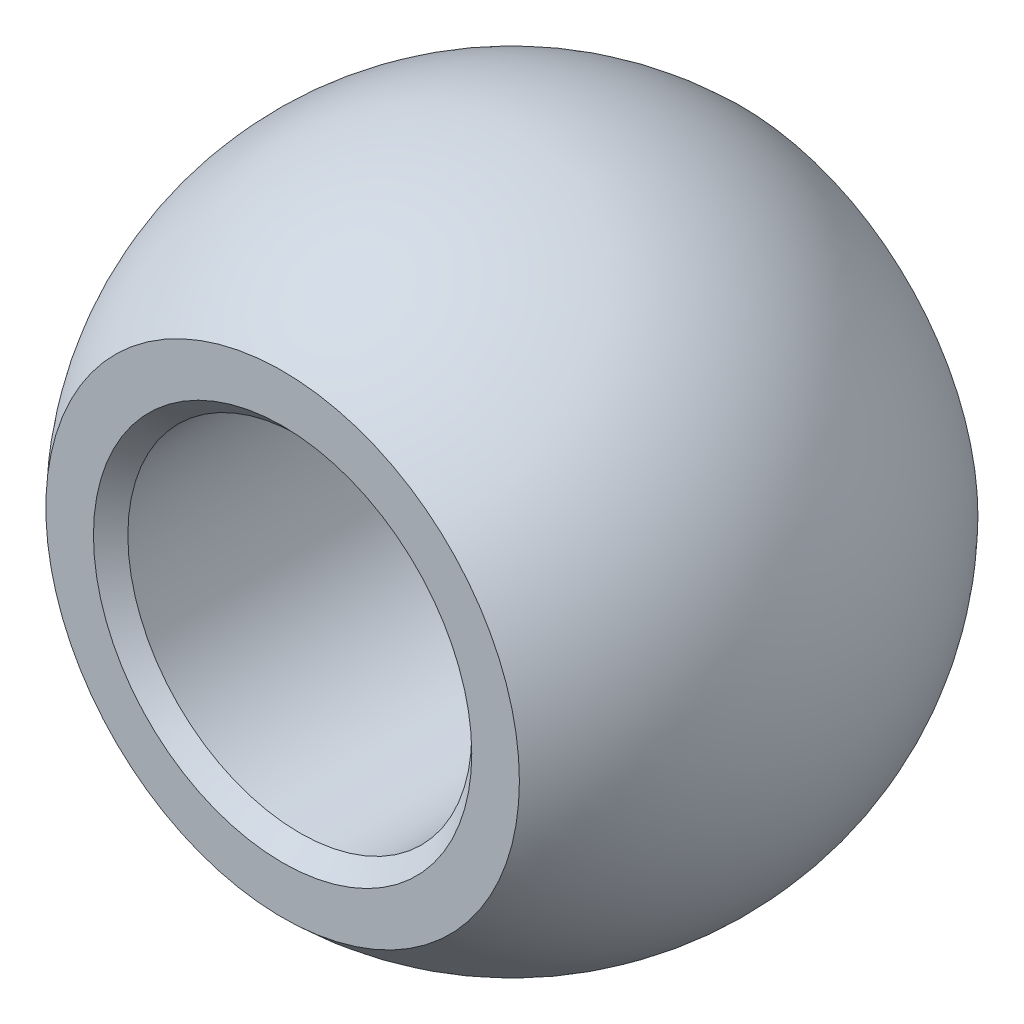
ISO-10303-21;
HEADER;
FILE_DESCRIPTION(('STEP AP214'),'2;1');
FILE_NAME('part.step','',(''),(''),'','','');
FILE_SCHEMA(('AUTOMOTIVE_DESIGN { 1 0 10303 214 1 1 1 1 }'));
ENDSEC;
DATA;
#1=APPLICATION_CONTEXT('core data for automotive mechanical design processes');
#2=APPLICATION_PROTOCOL_DEFINITION('international standard','automotive_design',2000,#1);
#3=PRODUCT_CONTEXT('',#1,'mechanical');
#4=PRODUCT('Part','Part','',(#3));
#5=PRODUCT_RELATED_PRODUCT_CATEGORY('part','',(#4));
#6=PRODUCT_DEFINITION_FORMATION('','',#4);
#7=PRODUCT_DEFINITION_CONTEXT('part definition',#1,'design');
#8=PRODUCT_DEFINITION('design','',#6,#7);
#9=PRODUCT_DEFINITION_SHAPE('','',#8);
#10=(LENGTH_UNIT() NAMED_UNIT(*) SI_UNIT(.MILLI.,.METRE.));
#11=(NAMED_UNIT(*) PLANE_ANGLE_UNIT() SI_UNIT($,.RADIAN.));
#12=(NAMED_UNIT(*) SI_UNIT($,.STERADIAN.) SOLID_ANGLE_UNIT());
#13=UNCERTAINTY_MEASURE_WITH_UNIT(LENGTH_MEASURE(1.E-05),#10,'distance_accuracy_value','');
#14=(GEOMETRIC_REPRESENTATION_CONTEXT(3) GLOBAL_UNCERTAINTY_ASSIGNED_CONTEXT((#13)) GLOBAL_UNIT_ASSIGNED_CONTEXT((#10,
#11,#12)) REPRESENTATION_CONTEXT('',''));
#15=CARTESIAN_POINT('',(0.,0.,0.));
#16=DIRECTION('',(0.,0.,1.));
#17=DIRECTION('',(1.,0.,0.));
#18=AXIS2_PLACEMENT_3D('',#15,#16,#17);
#19=CARTESIAN_POINT('',(0.,17.4625,0.));
#20=DIRECTION('',(0.,-1.,0.));
#21=DIRECTION('',(1.,0.,0.));
#22=AXIS2_PLACEMENT_3D('',#19,#20,#21);
#23=SPHERICAL_SURFACE('',#22,9.128125);
#24=CARTESIAN_POINT('',(0.,17.4625,0.));
#25=DIRECTION('',(0.,0.,1.));
#26=DIRECTION('',(1.,0.,0.));
#27=AXIS2_PLACEMENT_3D('',#24,#25,#26);
#28=SPHERICAL_SURFACE('',#27,9.128125);
#29=CARTESIAN_POINT('',(0.,17.4625,-6.35));
#30=DIRECTION('',(0.,0.,1.));
#31=DIRECTION('',(1.,0.,0.));
#32=AXIS2_PLACEMENT_3D('',#29,#30,#31);
#33=CIRCLE('',#32,6.55745118286251);
#34=CARTESIAN_POINT('',(6.55745118286252,17.4625,-6.35));
#35=VERTEX_POINT('',#34);
#36=EDGE_CURVE('E59',#35,#35,#33,.F.);
#37=ORIENTED_EDGE('',*,*,#36,.F.);
#38=EDGE_LOOP('',(#37));
#39=FACE_BOUND('',#38,.T.);
#40=CARTESIAN_POINT('',(0.,17.4625,6.35));
#41=DIRECTION('',(0.,0.,1.));
#42=DIRECTION('',(1.,0.,0.));
#43=AXIS2_PLACEMENT_3D('',#40,#41,#42);
#44=CIRCLE('',#43,6.55745118286252);
#45=CARTESIAN_POINT('',(6.55745118286252,17.4625,6.35));
#46=VERTEX_POINT('',#45);
#47=EDGE_CURVE('E62',#46,#46,#44,.F.);
#48=ORIENTED_EDGE('',*,*,#47,.T.);
#49=EDGE_LOOP('',(#48));
#50=FACE_BOUND('',#49,.T.);
#51=ADVANCED_FACE('F39',(#39,#50),#28,.T.);
#52=CARTESIAN_POINT('',(0.,17.4625,-9.128125));
#53=DIRECTION('',(0.,0.,1.));
#54=DIRECTION('',(1.,0.,0.));
#55=AXIS2_PLACEMENT_3D('',#52,#53,#54);
#56=CYLINDRICAL_SURFACE('',#55,4.7625);
#57=CARTESIAN_POINT('',(0.,17.4625,-5.87375));
#58=DIRECTION('',(0.,0.,1.));
#59=DIRECTION('',(1.,0.,0.));
#60=AXIS2_PLACEMENT_3D('',#57,#58,#59);
#61=CIRCLE('',#60,4.7625);
#62=CARTESIAN_POINT('',(4.7625,17.4625,-5.87375));
#63=VERTEX_POINT('',#62);
#64=EDGE_CURVE('E50',#63,#63,#61,.F.);
#65=ORIENTED_EDGE('',*,*,#64,.T.);
#66=EDGE_LOOP('',(#65));
#67=FACE_BOUND('',#66,.T.);
#68=CARTESIAN_POINT('',(0.,17.4625,5.87374999999999));
#69=DIRECTION('',(0.,0.,1.));
#70=DIRECTION('',(1.,0.,0.));
#71=AXIS2_PLACEMENT_3D('',#68,#69,#70);
#72=CIRCLE('',#71,4.7625);
#73=CARTESIAN_POINT('',(4.7625,17.4625,5.87374999999999));
#74=VERTEX_POINT('',#73);
#75=EDGE_CURVE('E54',#74,#74,#72,.T.);
#76=ORIENTED_EDGE('',*,*,#75,.T.);
#77=EDGE_LOOP('',(#76));
#78=FACE_BOUND('',#77,.T.);
#79=ADVANCED_FACE('F77',(#67,#78),#56,.F.);
#80=CARTESIAN_POINT('',(0.,0.,-6.35));
#81=DIRECTION('',(0.,0.,1.));
#82=DIRECTION('',(1.,0.,0.));
#83=AXIS2_PLACEMENT_3D('',#80,#81,#82);
#84=PLANE('',#83);
#85=CARTESIAN_POINT('',(0.,17.4625,-6.35));
#86=DIRECTION('',(0.,0.,1.));
#87=DIRECTION('',(1.,0.,0.));
#88=AXIS2_PLACEMENT_3D('',#85,#86,#87);
#89=CIRCLE('',#88,5.23875);
#90=CARTESIAN_POINT('',(5.23875,17.4625,-6.35));
#91=VERTEX_POINT('',#90);
#92=EDGE_CURVE('E46',#91,#91,#89,.T.);
#93=ORIENTED_EDGE('',*,*,#92,.T.);
#94=EDGE_LOOP('',(#93));
#95=FACE_BOUND('',#94,.T.);
#96=ORIENTED_EDGE('',*,*,#36,.T.);
#97=EDGE_LOOP('',(#96));
#98=FACE_BOUND('',#97,.T.);
#99=ADVANCED_FACE('F70',(#95,#98),#84,.F.);
#100=CARTESIAN_POINT('',(0.,0.,6.35));
#101=DIRECTION('',(0.,0.,1.));
#102=DIRECTION('',(1.,0.,0.));
#103=AXIS2_PLACEMENT_3D('',#100,#101,#102);
#104=PLANE('',#103);
#105=CARTESIAN_POINT('',(0.,17.4625,6.35));
#106=DIRECTION('',(0.,0.,1.));
#107=DIRECTION('',(1.,0.,0.));
#108=AXIS2_PLACEMENT_3D('',#105,#106,#107);
#109=CIRCLE('',#108,5.23875);
#110=CARTESIAN_POINT('',(5.23875,17.4625,6.35));
#111=VERTEX_POINT('',#110);
#112=EDGE_CURVE('E10',#111,#111,#109,.F.);
#113=ORIENTED_EDGE('',*,*,#112,.T.);
#114=EDGE_LOOP('',(#113));
#115=FACE_BOUND('',#114,.T.);
#116=ORIENTED_EDGE('',*,*,#47,.F.);
#117=EDGE_LOOP('',(#116));
#118=FACE_BOUND('',#117,.T.);
#119=ADVANCED_FACE('F67',(#115,#118),#104,.T.);
#120=CARTESIAN_POINT('',(0.,17.4625,-5.87375));
#121=DIRECTION('',(0.,0.,-1.));
#122=DIRECTION('',(-1.,0.,0.));
#123=AXIS2_PLACEMENT_3D('',#120,#121,#122);
#124=CONICAL_SURFACE('',#123,4.7625,0.785398163397448);
#125=ORIENTED_EDGE('',*,*,#92,.F.);
#126=EDGE_LOOP('',(#125));
#127=FACE_BOUND('',#126,.T.);
#128=ORIENTED_EDGE('',*,*,#64,.F.);
#129=EDGE_LOOP('',(#128));
#130=FACE_BOUND('',#129,.T.);
#131=ADVANCED_FACE('F69',(#127,#130),#124,.F.);
#132=CARTESIAN_POINT('',(0.,17.4625,6.35));
#133=DIRECTION('',(0.,0.,1.));
#134=DIRECTION('',(1.,0.,0.));
#135=AXIS2_PLACEMENT_3D('',#132,#133,#134);
#136=CONICAL_SURFACE('',#135,5.23875,0.785398163397448);
#137=ORIENTED_EDGE('',*,*,#75,.F.);
#138=EDGE_LOOP('',(#137));
#139=FACE_BOUND('',#138,.T.);
#140=ORIENTED_EDGE('',*,*,#112,.F.);
#141=EDGE_LOOP('',(#140));
#142=FACE_BOUND('',#141,.T.);
#143=ADVANCED_FACE('F41',(#139,#142),#136,.F.);
#144=CLOSED_SHELL('',(#51,#79,#99,#119,#131,#143));
#145=MANIFOLD_SOLID_BREP('B2',#144);
#146=ADVANCED_BREP_SHAPE_REPRESENTATION('',(#18,#145),#14);
#147=SHAPE_DEFINITION_REPRESENTATION(#9,#146);
ENDSEC;
END-ISO-10303-21;
